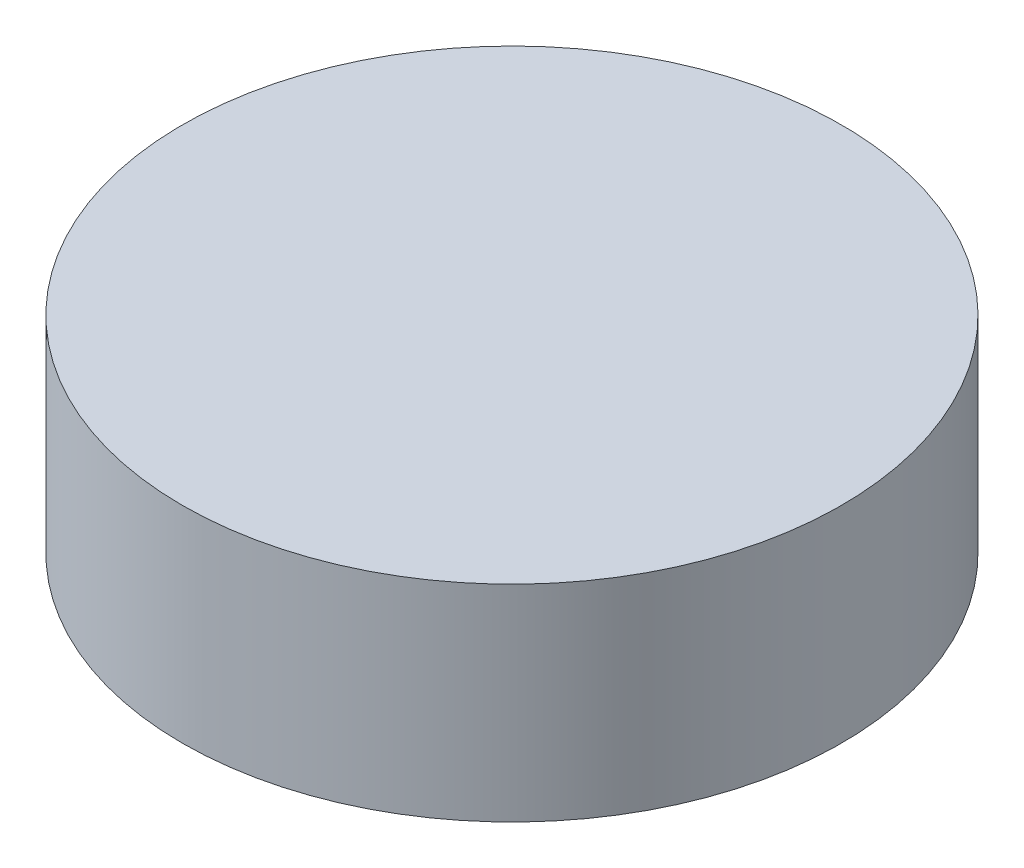
ISO-10303-21;
HEADER;
FILE_DESCRIPTION(('STEP AP214'),'2;1');
FILE_NAME('part.step','',(''),(''),'','','');
FILE_SCHEMA(('AUTOMOTIVE_DESIGN { 1 0 10303 214 1 1 1 1 }'));
ENDSEC;
DATA;
#1=APPLICATION_CONTEXT('core data for automotive mechanical design processes');
#2=APPLICATION_PROTOCOL_DEFINITION('international standard','automotive_design',2000,#1);
#3=PRODUCT_CONTEXT('',#1,'mechanical');
#4=PRODUCT('Part','Part','',(#3));
#5=PRODUCT_RELATED_PRODUCT_CATEGORY('part','',(#4));
#6=PRODUCT_DEFINITION_FORMATION('','',#4);
#7=PRODUCT_DEFINITION_CONTEXT('part definition',#1,'design');
#8=PRODUCT_DEFINITION('design','',#6,#7);
#9=PRODUCT_DEFINITION_SHAPE('','',#8);
#10=(LENGTH_UNIT() NAMED_UNIT(*) SI_UNIT(.MILLI.,.METRE.));
#11=(NAMED_UNIT(*) PLANE_ANGLE_UNIT() SI_UNIT($,.RADIAN.));
#12=(NAMED_UNIT(*) SI_UNIT($,.STERADIAN.) SOLID_ANGLE_UNIT());
#13=UNCERTAINTY_MEASURE_WITH_UNIT(LENGTH_MEASURE(1.E-05),#10,'distance_accuracy_value','');
#14=(GEOMETRIC_REPRESENTATION_CONTEXT(3) GLOBAL_UNCERTAINTY_ASSIGNED_CONTEXT((#13)) GLOBAL_UNIT_ASSIGNED_CONTEXT((#10,
#11,#12)) REPRESENTATION_CONTEXT('',''));
#15=CARTESIAN_POINT('',(0.,0.,0.));
#16=DIRECTION('',(0.,0.,1.));
#17=DIRECTION('',(1.,0.,0.));
#18=AXIS2_PLACEMENT_3D('',#15,#16,#17);
#19=CARTESIAN_POINT('',(0.,17.859375,0.));
#20=DIRECTION('',(0.,-1.,0.));
#21=DIRECTION('',(0.,0.,-1.));
#22=AXIS2_PLACEMENT_3D('',#19,#20,#21);
#23=CYLINDRICAL_SURFACE('',#22,28.575);
#24=CARTESIAN_POINT('',(0.,17.859375,0.));
#25=DIRECTION('',(0.,1.,0.));
#26=DIRECTION('',(0.,0.,1.));
#27=AXIS2_PLACEMENT_3D('',#24,#25,#26);
#28=CIRCLE('',#27,28.575);
#29=CARTESIAN_POINT('',(0.,17.859375,28.575));
#30=VERTEX_POINT('',#29);
#31=EDGE_CURVE('E10',#30,#30,#28,.T.);
#32=ORIENTED_EDGE('',*,*,#31,.F.);
#33=EDGE_LOOP('',(#32));
#34=FACE_BOUND('',#33,.T.);
#35=CARTESIAN_POINT('',(0.,0.,0.));
#36=DIRECTION('',(0.,1.,0.));
#37=DIRECTION('',(0.,0.,1.));
#38=AXIS2_PLACEMENT_3D('',#35,#36,#37);
#39=CIRCLE('',#38,28.575);
#40=CARTESIAN_POINT('',(0.,0.,28.575));
#41=VERTEX_POINT('',#40);
#42=EDGE_CURVE('E46',#41,#41,#39,.T.);
#43=ORIENTED_EDGE('',*,*,#42,.T.);
#44=EDGE_LOOP('',(#43));
#45=FACE_BOUND('',#44,.T.);
#46=ADVANCED_FACE('F43',(#34,#45),#23,.T.);
#47=CARTESIAN_POINT('',(0.,17.859375,0.));
#48=DIRECTION('',(0.,1.,0.));
#49=DIRECTION('',(0.,0.,1.));
#50=AXIS2_PLACEMENT_3D('',#47,#48,#49);
#51=PLANE('',#50);
#52=ORIENTED_EDGE('',*,*,#31,.T.);
#53=EDGE_LOOP('',(#52));
#54=FACE_BOUND('',#53,.T.);
#55=ADVANCED_FACE('F78',(#54),#51,.T.);
#56=CARTESIAN_POINT('',(0.,0.,0.));
#57=DIRECTION('',(0.,1.,0.));
#58=DIRECTION('',(0.,0.,1.));
#59=AXIS2_PLACEMENT_3D('',#56,#57,#58);
#60=PLANE('',#59);
#61=CARTESIAN_POINT('',(0.,0.,0.));
#62=DIRECTION('',(0.,1.,0.));
#63=DIRECTION('',(0.,0.,1.));
#64=AXIS2_PLACEMENT_3D('',#61,#62,#63);
#65=CIRCLE('',#64,26.035);
#66=CARTESIAN_POINT('',(0.,0.,26.035));
#67=VERTEX_POINT('',#66);
#68=EDGE_CURVE('E57',#67,#67,#65,.T.);
#69=ORIENTED_EDGE('',*,*,#68,.T.);
#70=EDGE_LOOP('',(#69));
#71=FACE_BOUND('',#70,.T.);
#72=ORIENTED_EDGE('',*,*,#42,.F.);
#73=EDGE_LOOP('',(#72));
#74=FACE_BOUND('',#73,.T.);
#75=ADVANCED_FACE('F74',(#71,#74),#60,.F.);
#76=CARTESIAN_POINT('',(0.,17.859375,0.));
#77=DIRECTION('',(0.,-1.,0.));
#78=DIRECTION('',(0.,0.,-1.));
#79=AXIS2_PLACEMENT_3D('',#76,#77,#78);
#80=CYLINDRICAL_SURFACE('',#79,26.035);
#81=CARTESIAN_POINT('',(0.,15.319375,0.));
#82=DIRECTION('',(0.,1.,0.));
#83=DIRECTION('',(0.,0.,1.));
#84=AXIS2_PLACEMENT_3D('',#81,#82,#83);
#85=CIRCLE('',#84,26.035);
#86=CARTESIAN_POINT('',(0.,15.319375,26.035));
#87=VERTEX_POINT('',#86);
#88=EDGE_CURVE('E55',#87,#87,#85,.T.);
#89=ORIENTED_EDGE('',*,*,#88,.T.);
#90=EDGE_LOOP('',(#89));
#91=FACE_BOUND('',#90,.T.);
#92=ORIENTED_EDGE('',*,*,#68,.F.);
#93=EDGE_LOOP('',(#92));
#94=FACE_BOUND('',#93,.T.);
#95=ADVANCED_FACE('F65',(#91,#94),#80,.F.);
#96=CARTESIAN_POINT('',(0.,15.319375,0.));
#97=DIRECTION('',(0.,1.,0.));
#98=DIRECTION('',(0.,0.,1.));
#99=AXIS2_PLACEMENT_3D('',#96,#97,#98);
#100=PLANE('',#99);
#101=ORIENTED_EDGE('',*,*,#88,.F.);
#102=EDGE_LOOP('',(#101));
#103=FACE_BOUND('',#102,.T.);
#104=ADVANCED_FACE('F68',(#103),#100,.F.);
#105=CLOSED_SHELL('',(#46,#55,#75,#95,#104));
#106=MANIFOLD_SOLID_BREP('B2',#105);
#107=ADVANCED_BREP_SHAPE_REPRESENTATION('',(#18,#106),#14);
#108=SHAPE_DEFINITION_REPRESENTATION(#9,#107);
ENDSEC;
END-ISO-10303-21;
